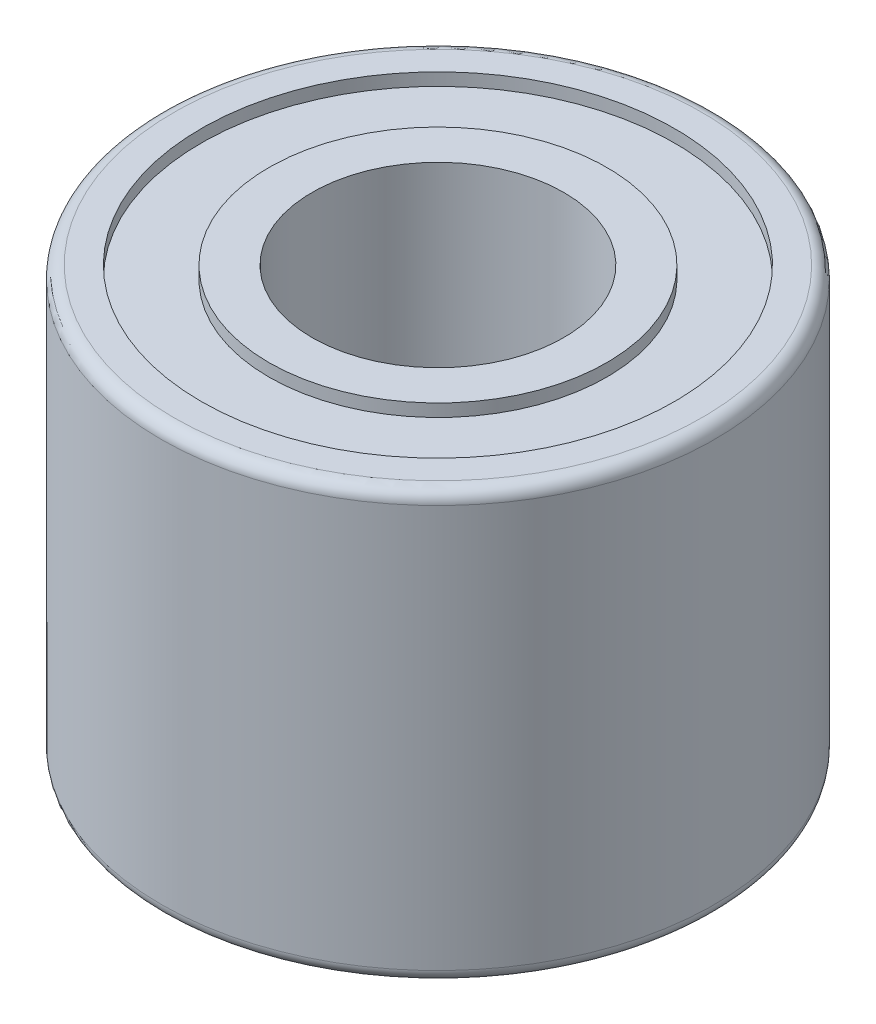
ISO-10303-21;
HEADER;
FILE_DESCRIPTION(('STEP AP214'),'2;1');
FILE_NAME('part.step','',(''),(''),'','','');
FILE_SCHEMA(('AUTOMOTIVE_DESIGN { 1 0 10303 214 1 1 1 1 }'));
ENDSEC;
DATA;
#1=APPLICATION_CONTEXT('core data for automotive mechanical design processes');
#2=APPLICATION_PROTOCOL_DEFINITION('international standard','automotive_design',2000,#1);
#3=PRODUCT_CONTEXT('',#1,'mechanical');
#4=PRODUCT('Part','Part','',(#3));
#5=PRODUCT_RELATED_PRODUCT_CATEGORY('part','',(#4));
#6=PRODUCT_DEFINITION_FORMATION('','',#4);
#7=PRODUCT_DEFINITION_CONTEXT('part definition',#1,'design');
#8=PRODUCT_DEFINITION('design','',#6,#7);
#9=PRODUCT_DEFINITION_SHAPE('','',#8);
#10=(LENGTH_UNIT() NAMED_UNIT(*) SI_UNIT(.MILLI.,.METRE.));
#11=(NAMED_UNIT(*) PLANE_ANGLE_UNIT() SI_UNIT($,.RADIAN.));
#12=(NAMED_UNIT(*) SI_UNIT($,.STERADIAN.) SOLID_ANGLE_UNIT());
#13=UNCERTAINTY_MEASURE_WITH_UNIT(LENGTH_MEASURE(1.E-05),#10,'distance_accuracy_value','');
#14=(GEOMETRIC_REPRESENTATION_CONTEXT(3) GLOBAL_UNCERTAINTY_ASSIGNED_CONTEXT((#13)) GLOBAL_UNIT_ASSIGNED_CONTEXT((#10,
#11,#12)) REPRESENTATION_CONTEXT('',''));
#15=CARTESIAN_POINT('',(0.,0.,0.));
#16=DIRECTION('',(0.,0.,1.));
#17=DIRECTION('',(1.,0.,0.));
#18=AXIS2_PLACEMENT_3D('',#15,#16,#17);
#19=CARTESIAN_POINT('',(0.,17.,0.));
#20=DIRECTION('',(0.,1.,0.));
#21=DIRECTION('',(0.,0.,1.));
#22=AXIS2_PLACEMENT_3D('',#19,#20,#21);
#23=PLANE('',#22);
#24=CARTESIAN_POINT('',(0.,17.,0.));
#25=DIRECTION('',(0.,1.,0.));
#26=DIRECTION('',(0.,0.,1.));
#27=AXIS2_PLACEMENT_3D('',#24,#25,#26);
#28=CIRCLE('',#27,6.715);
#29=CARTESIAN_POINT('',(0.,17.,6.715));
#30=VERTEX_POINT('',#29);
#31=EDGE_CURVE('E78',#30,#30,#28,.T.);
#32=ORIENTED_EDGE('',*,*,#31,.T.);
#33=EDGE_LOOP('',(#32));
#34=FACE_BOUND('',#33,.T.);
#35=CARTESIAN_POINT('',(0.,17.,0.));
#36=DIRECTION('',(0.,1.,0.));
#37=DIRECTION('',(0.,0.,1.));
#38=AXIS2_PLACEMENT_3D('',#35,#36,#37);
#39=CIRCLE('',#38,5.);
#40=CARTESIAN_POINT('',(0.,17.,5.));
#41=VERTEX_POINT('',#40);
#42=EDGE_CURVE('E79',#41,#41,#39,.T.);
#43=ORIENTED_EDGE('',*,*,#42,.F.);
#44=EDGE_LOOP('',(#43));
#45=FACE_BOUND('',#44,.T.);
#46=ADVANCED_FACE('F47',(#34,#45),#23,.T.);
#47=CARTESIAN_POINT('',(0.,17.,0.));
#48=DIRECTION('',(0.,-1.,0.));
#49=DIRECTION('',(0.,0.,-1.));
#50=AXIS2_PLACEMENT_3D('',#47,#48,#49);
#51=CYLINDRICAL_SURFACE('',#50,6.715);
#52=CARTESIAN_POINT('',(0.,16.5,0.));
#53=DIRECTION('',(0.,1.,0.));
#54=DIRECTION('',(0.,0.,1.));
#55=AXIS2_PLACEMENT_3D('',#52,#53,#54);
#56=CIRCLE('',#55,6.715);
#57=CARTESIAN_POINT('',(0.,16.5,6.715));
#58=VERTEX_POINT('',#57);
#59=EDGE_CURVE('E87',#58,#58,#56,.T.);
#60=ORIENTED_EDGE('',*,*,#59,.T.);
#61=EDGE_LOOP('',(#60));
#62=FACE_BOUND('',#61,.T.);
#63=ORIENTED_EDGE('',*,*,#31,.F.);
#64=EDGE_LOOP('',(#63));
#65=FACE_BOUND('',#64,.T.);
#66=ADVANCED_FACE('F141',(#62,#65),#51,.T.);
#67=CARTESIAN_POINT('',(0.,17.,0.));
#68=DIRECTION('',(0.,-1.,0.));
#69=DIRECTION('',(0.,0.,-1.));
#70=AXIS2_PLACEMENT_3D('',#67,#68,#69);
#71=CYLINDRICAL_SURFACE('',#70,5.);
#72=ORIENTED_EDGE('',*,*,#42,.T.);
#73=EDGE_LOOP('',(#72));
#74=FACE_BOUND('',#73,.T.);
#75=CARTESIAN_POINT('',(0.,0.,0.));
#76=DIRECTION('',(0.,1.,0.));
#77=DIRECTION('',(0.,0.,1.));
#78=AXIS2_PLACEMENT_3D('',#75,#76,#77);
#79=CIRCLE('',#78,5.);
#80=CARTESIAN_POINT('',(0.,0.,5.));
#81=VERTEX_POINT('',#80);
#82=EDGE_CURVE('E83',#81,#81,#79,.T.);
#83=ORIENTED_EDGE('',*,*,#82,.F.);
#84=EDGE_LOOP('',(#83));
#85=FACE_BOUND('',#84,.T.);
#86=ADVANCED_FACE('F151',(#74,#85),#71,.F.);
#87=CARTESIAN_POINT('',(0.,16.5,0.));
#88=DIRECTION('',(0.,1.,0.));
#89=DIRECTION('',(0.,0.,1.));
#90=AXIS2_PLACEMENT_3D('',#87,#88,#89);
#91=PLANE('',#90);
#92=ORIENTED_EDGE('',*,*,#59,.F.);
#93=EDGE_LOOP('',(#92));
#94=FACE_BOUND('',#93,.T.);
#95=CARTESIAN_POINT('',(0.,16.5,0.));
#96=DIRECTION('',(0.,1.,0.));
#97=DIRECTION('',(0.,0.,1.));
#98=AXIS2_PLACEMENT_3D('',#95,#96,#97);
#99=CIRCLE('',#98,9.4);
#100=CARTESIAN_POINT('',(0.,16.5,9.4));
#101=VERTEX_POINT('',#100);
#102=EDGE_CURVE('E101',#101,#101,#99,.T.);
#103=ORIENTED_EDGE('',*,*,#102,.T.);
#104=EDGE_LOOP('',(#103));
#105=FACE_BOUND('',#104,.T.);
#106=ADVANCED_FACE('F121',(#94,#105),#91,.T.);
#107=CARTESIAN_POINT('',(0.,0.,0.));
#108=DIRECTION('',(0.,1.,0.));
#109=DIRECTION('',(0.,0.,1.));
#110=AXIS2_PLACEMENT_3D('',#107,#108,#109);
#111=CYLINDRICAL_SURFACE('',#110,9.4);
#112=CARTESIAN_POINT('',(0.,0.,0.));
#113=DIRECTION('',(0.,1.,0.));
#114=DIRECTION('',(0.,0.,1.));
#115=AXIS2_PLACEMENT_3D('',#112,#113,#114);
#116=CIRCLE('',#115,9.4);
#117=CARTESIAN_POINT('',(0.,0.,9.4));
#118=VERTEX_POINT('',#117);
#119=EDGE_CURVE('E105',#118,#118,#116,.T.);
#120=ORIENTED_EDGE('',*,*,#119,.F.);
#121=EDGE_LOOP('',(#120));
#122=FACE_BOUND('',#121,.T.);
#123=CARTESIAN_POINT('',(0.,0.5,0.));
#124=DIRECTION('',(0.,1.,0.));
#125=DIRECTION('',(0.,0.,1.));
#126=AXIS2_PLACEMENT_3D('',#123,#124,#125);
#127=CIRCLE('',#126,9.4);
#128=CARTESIAN_POINT('',(0.,0.5,9.4));
#129=VERTEX_POINT('',#128);
#130=EDGE_CURVE('E94',#129,#129,#127,.T.);
#131=ORIENTED_EDGE('',*,*,#130,.T.);
#132=EDGE_LOOP('',(#131));
#133=FACE_BOUND('',#132,.T.);
#134=ADVANCED_FACE('F117',(#122,#133),#111,.F.);
#135=CARTESIAN_POINT('',(0.,0.,0.));
#136=DIRECTION('',(0.,1.,0.));
#137=DIRECTION('',(0.,0.,1.));
#138=AXIS2_PLACEMENT_3D('',#135,#136,#137);
#139=CYLINDRICAL_SURFACE('',#138,11.);
#140=CARTESIAN_POINT('',(0.,0.5,0.));
#141=DIRECTION('',(0.,1.,0.));
#142=DIRECTION('',(0.,0.,1.));
#143=AXIS2_PLACEMENT_3D('',#140,#141,#142);
#144=CIRCLE('',#143,11.);
#145=CARTESIAN_POINT('',(0.,0.5,11.));
#146=VERTEX_POINT('',#145);
#147=EDGE_CURVE('E61',#146,#146,#144,.T.);
#148=ORIENTED_EDGE('',*,*,#147,.T.);
#149=EDGE_LOOP('',(#148));
#150=FACE_BOUND('',#149,.T.);
#151=CARTESIAN_POINT('',(0.,16.5,0.));
#152=DIRECTION('',(0.,1.,0.));
#153=DIRECTION('',(0.,0.,1.));
#154=AXIS2_PLACEMENT_3D('',#151,#152,#153);
#155=CIRCLE('',#154,11.);
#156=CARTESIAN_POINT('',(0.,16.5,11.));
#157=VERTEX_POINT('',#156);
#158=EDGE_CURVE('E67',#157,#157,#155,.F.);
#159=ORIENTED_EDGE('',*,*,#158,.T.);
#160=EDGE_LOOP('',(#159));
#161=FACE_BOUND('',#160,.T.);
#162=ADVANCED_FACE('F120',(#150,#161),#139,.T.);
#163=CARTESIAN_POINT('',(0.,0.,0.));
#164=DIRECTION('',(0.,1.,0.));
#165=DIRECTION('',(0.,0.,1.));
#166=AXIS2_PLACEMENT_3D('',#163,#164,#165);
#167=PLANE('',#166);
#168=CARTESIAN_POINT('',(0.,0.,0.));
#169=DIRECTION('',(0.,1.,0.));
#170=DIRECTION('',(0.,0.,1.));
#171=AXIS2_PLACEMENT_3D('',#168,#169,#170);
#172=CIRCLE('',#171,10.5);
#173=CARTESIAN_POINT('',(0.,0.,10.5));
#174=VERTEX_POINT('',#173);
#175=EDGE_CURVE('E55',#174,#174,#172,.F.);
#176=ORIENTED_EDGE('',*,*,#175,.T.);
#177=EDGE_LOOP('',(#176));
#178=FACE_BOUND('',#177,.T.);
#179=ORIENTED_EDGE('',*,*,#119,.T.);
#180=EDGE_LOOP('',(#179));
#181=FACE_BOUND('',#180,.T.);
#182=ADVANCED_FACE('F115',(#178,#181),#167,.F.);
#183=CARTESIAN_POINT('',(0.,17.,0.));
#184=DIRECTION('',(0.,1.,0.));
#185=DIRECTION('',(0.,0.,1.));
#186=AXIS2_PLACEMENT_3D('',#183,#184,#185);
#187=PLANE('',#186);
#188=CARTESIAN_POINT('',(0.,17.,0.));
#189=DIRECTION('',(0.,1.,0.));
#190=DIRECTION('',(0.,0.,1.));
#191=AXIS2_PLACEMENT_3D('',#188,#189,#190);
#192=CIRCLE('',#191,10.5);
#193=CARTESIAN_POINT('',(0.,17.,10.5));
#194=VERTEX_POINT('',#193);
#195=EDGE_CURVE('E10',#194,#194,#192,.T.);
#196=ORIENTED_EDGE('',*,*,#195,.T.);
#197=EDGE_LOOP('',(#196));
#198=FACE_BOUND('',#197,.T.);
#199=CARTESIAN_POINT('',(0.,17.,0.));
#200=DIRECTION('',(0.,1.,0.));
#201=DIRECTION('',(0.,0.,1.));
#202=AXIS2_PLACEMENT_3D('',#199,#200,#201);
#203=CIRCLE('',#202,9.4);
#204=CARTESIAN_POINT('',(0.,17.,9.4));
#205=VERTEX_POINT('',#204);
#206=EDGE_CURVE('E106',#205,#205,#203,.T.);
#207=ORIENTED_EDGE('',*,*,#206,.F.);
#208=EDGE_LOOP('',(#207));
#209=FACE_BOUND('',#208,.T.);
#210=ADVANCED_FACE('F158',(#198,#209),#187,.T.);
#211=ORIENTED_EDGE('',*,*,#102,.F.);
#212=EDGE_LOOP('',(#211));
#213=FACE_BOUND('',#212,.T.);
#214=ORIENTED_EDGE('',*,*,#206,.T.);
#215=EDGE_LOOP('',(#214));
#216=FACE_BOUND('',#215,.T.);
#217=ADVANCED_FACE('F123',(#213,#216),#111,.F.);
#218=CARTESIAN_POINT('',(0.,0.,0.));
#219=DIRECTION('',(0.,1.,0.));
#220=DIRECTION('',(0.,0.,1.));
#221=AXIS2_PLACEMENT_3D('',#218,#219,#220);
#222=PLANE('',#221);
#223=CARTESIAN_POINT('',(0.,0.,0.));
#224=DIRECTION('',(0.,1.,0.));
#225=DIRECTION('',(0.,0.,1.));
#226=AXIS2_PLACEMENT_3D('',#223,#224,#225);
#227=CIRCLE('',#226,6.715);
#228=CARTESIAN_POINT('',(0.,0.,6.715));
#229=VERTEX_POINT('',#228);
#230=EDGE_CURVE('E74',#229,#229,#227,.T.);
#231=ORIENTED_EDGE('',*,*,#230,.F.);
#232=EDGE_LOOP('',(#231));
#233=FACE_BOUND('',#232,.T.);
#234=ORIENTED_EDGE('',*,*,#82,.T.);
#235=EDGE_LOOP('',(#234));
#236=FACE_BOUND('',#235,.T.);
#237=ADVANCED_FACE('F138',(#233,#236),#222,.F.);
#238=ORIENTED_EDGE('',*,*,#230,.T.);
#239=EDGE_LOOP('',(#238));
#240=FACE_BOUND('',#239,.T.);
#241=CARTESIAN_POINT('',(0.,0.5,0.));
#242=DIRECTION('',(0.,1.,0.));
#243=DIRECTION('',(0.,0.,1.));
#244=AXIS2_PLACEMENT_3D('',#241,#242,#243);
#245=CIRCLE('',#244,6.715);
#246=CARTESIAN_POINT('',(0.,0.5,6.715));
#247=VERTEX_POINT('',#246);
#248=EDGE_CURVE('E73',#247,#247,#245,.T.);
#249=ORIENTED_EDGE('',*,*,#248,.F.);
#250=EDGE_LOOP('',(#249));
#251=FACE_BOUND('',#250,.T.);
#252=ADVANCED_FACE('F129',(#240,#251),#51,.T.);
#253=CARTESIAN_POINT('',(0.,0.5,0.));
#254=DIRECTION('',(0.,1.,0.));
#255=DIRECTION('',(0.,0.,1.));
#256=AXIS2_PLACEMENT_3D('',#253,#254,#255);
#257=PLANE('',#256);
#258=ORIENTED_EDGE('',*,*,#248,.T.);
#259=EDGE_LOOP('',(#258));
#260=FACE_BOUND('',#259,.T.);
#261=ORIENTED_EDGE('',*,*,#130,.F.);
#262=EDGE_LOOP('',(#261));
#263=FACE_BOUND('',#262,.T.);
#264=ADVANCED_FACE('F126',(#260,#263),#257,.F.);
#265=CARTESIAN_POINT('',(0.,0.5,0.));
#266=DIRECTION('',(0.,1.,0.));
#267=DIRECTION('',(0.,0.,1.));
#268=AXIS2_PLACEMENT_3D('',#265,#266,#267);
#269=TOROIDAL_SURFACE('',#268,10.5,0.5);
#270=ORIENTED_EDGE('',*,*,#175,.F.);
#271=EDGE_LOOP('',(#270));
#272=FACE_BOUND('',#271,.T.);
#273=ORIENTED_EDGE('',*,*,#147,.F.);
#274=EDGE_LOOP('',(#273));
#275=FACE_BOUND('',#274,.T.);
#276=ADVANCED_FACE('F128',(#272,#275),#269,.T.);
#277=CARTESIAN_POINT('',(0.,16.5,0.));
#278=DIRECTION('',(0.,1.,0.));
#279=DIRECTION('',(0.,0.,1.));
#280=AXIS2_PLACEMENT_3D('',#277,#278,#279);
#281=TOROIDAL_SURFACE('',#280,10.5,0.5);
#282=ORIENTED_EDGE('',*,*,#158,.F.);
#283=EDGE_LOOP('',(#282));
#284=FACE_BOUND('',#283,.T.);
#285=ORIENTED_EDGE('',*,*,#195,.F.);
#286=EDGE_LOOP('',(#285));
#287=FACE_BOUND('',#286,.T.);
#288=ADVANCED_FACE('F49',(#284,#287),#281,.T.);
#289=CLOSED_SHELL('',(#46,#66,#86,#106,#134,#162,#182,#210,#217,#237,#252,#264,#276,#288));
#290=MANIFOLD_SOLID_BREP('B2',#289);
#291=ADVANCED_BREP_SHAPE_REPRESENTATION('',(#18,#290),#14);
#292=SHAPE_DEFINITION_REPRESENTATION(#9,#291);
ENDSEC;
END-ISO-10303-21;
